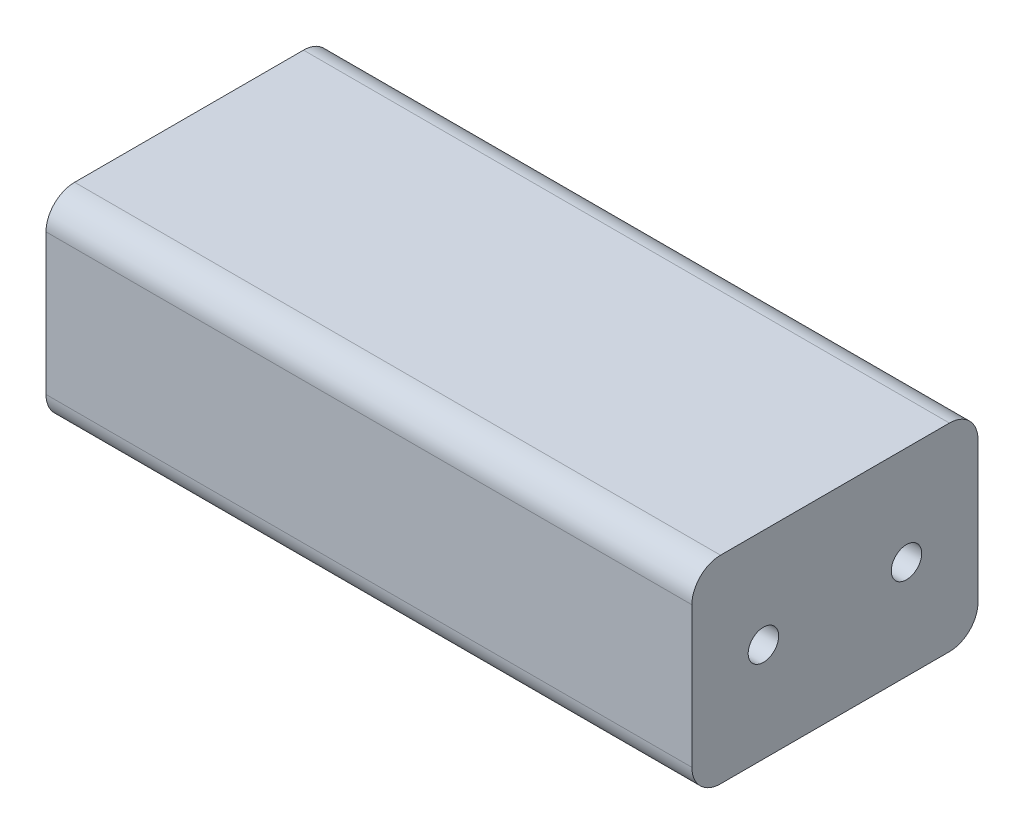
ISO-10303-21;
HEADER;
FILE_DESCRIPTION(('STEP AP214'),'2;1');
FILE_NAME('part.step','',(''),(''),'','','');
FILE_SCHEMA(('AUTOMOTIVE_DESIGN { 1 0 10303 214 1 1 1 1 }'));
ENDSEC;
DATA;
#1=APPLICATION_CONTEXT('core data for automotive mechanical design processes');
#2=APPLICATION_PROTOCOL_DEFINITION('international standard','automotive_design',2000,#1);
#3=PRODUCT_CONTEXT('',#1,'mechanical');
#4=PRODUCT('Part','Part','',(#3));
#5=PRODUCT_RELATED_PRODUCT_CATEGORY('part','',(#4));
#6=PRODUCT_DEFINITION_FORMATION('','',#4);
#7=PRODUCT_DEFINITION_CONTEXT('part definition',#1,'design');
#8=PRODUCT_DEFINITION('design','',#6,#7);
#9=PRODUCT_DEFINITION_SHAPE('','',#8);
#10=(LENGTH_UNIT() NAMED_UNIT(*) SI_UNIT(.MILLI.,.METRE.));
#11=(NAMED_UNIT(*) PLANE_ANGLE_UNIT() SI_UNIT($,.RADIAN.));
#12=(NAMED_UNIT(*) SI_UNIT($,.STERADIAN.) SOLID_ANGLE_UNIT());
#13=UNCERTAINTY_MEASURE_WITH_UNIT(LENGTH_MEASURE(1.E-05),#10,'distance_accuracy_value','');
#14=(GEOMETRIC_REPRESENTATION_CONTEXT(3) GLOBAL_UNCERTAINTY_ASSIGNED_CONTEXT((#13)) GLOBAL_UNIT_ASSIGNED_CONTEXT((#10,
#11,#12)) REPRESENTATION_CONTEXT('',''));
#15=CARTESIAN_POINT('',(0.,0.,0.));
#16=DIRECTION('',(0.,0.,1.));
#17=DIRECTION('',(1.,0.,0.));
#18=AXIS2_PLACEMENT_3D('',#15,#16,#17);
#19=CARTESIAN_POINT('',(28.67025,8.7910035,-12.7));
#20=DIRECTION('',(0.,0.,1.));
#21=DIRECTION('',(1.,0.,0.));
#22=AXIS2_PLACEMENT_3D('',#19,#20,#21);
#23=PLANE('',#22);
#24=DIRECTION('',(0.,1.,0.));
#25=VECTOR('',#24,1.);
#26=CARTESIAN_POINT('',(28.67025,8.7910035,-12.7));
#27=LINE('',#26,#25);
#28=CARTESIAN_POINT('',(28.67025,-6.2510035,-12.7));
#29=VERTEX_POINT('',#28);
#30=CARTESIAN_POINT('',(28.67025,6.2510035,-12.7));
#31=VERTEX_POINT('',#30);
#32=EDGE_CURVE('E154',#29,#31,#27,.T.);
#33=ORIENTED_EDGE('',*,*,#32,.F.);
#34=DIRECTION('',(-1.,0.,0.));
#35=VECTOR('',#34,1.);
#36=CARTESIAN_POINT('',(28.67025,-6.2510035,-12.7));
#37=LINE('',#36,#35);
#38=CARTESIAN_POINT('',(-28.67025,-6.2510035,-12.7));
#39=VERTEX_POINT('',#38);
#40=EDGE_CURVE('E176',#29,#39,#37,.T.);
#41=ORIENTED_EDGE('',*,*,#40,.T.);
#42=DIRECTION('',(0.,1.,0.));
#43=VECTOR('',#42,1.);
#44=CARTESIAN_POINT('',(-28.67025,8.7910035,-12.7));
#45=LINE('',#44,#43);
#46=CARTESIAN_POINT('',(-28.67025,6.2510035,-12.7));
#47=VERTEX_POINT('',#46);
#48=EDGE_CURVE('E153',#39,#47,#45,.T.);
#49=ORIENTED_EDGE('',*,*,#48,.T.);
#50=DIRECTION('',(-1.,0.,0.));
#51=VECTOR('',#50,1.);
#52=CARTESIAN_POINT('',(28.67025,6.2510035,-12.7));
#53=LINE('',#52,#51);
#54=EDGE_CURVE('E165',#47,#31,#53,.F.);
#55=ORIENTED_EDGE('',*,*,#54,.T.);
#56=EDGE_LOOP('',(#33,#41,#49,#55));
#57=FACE_BOUND('',#56,.T.);
#58=ADVANCED_FACE('F43',(#57),#23,.F.);
#59=CARTESIAN_POINT('',(28.67025,8.7910035,12.7));
#60=DIRECTION('',(0.,-1.,0.));
#61=DIRECTION('',(0.,0.,-1.));
#62=AXIS2_PLACEMENT_3D('',#59,#60,#61);
#63=PLANE('',#62);
#64=DIRECTION('',(0.,0.,1.));
#65=VECTOR('',#64,1.);
#66=CARTESIAN_POINT('',(28.67025,8.7910035,12.7));
#67=LINE('',#66,#65);
#68=CARTESIAN_POINT('',(28.67025,8.7910035,-10.16));
#69=VERTEX_POINT('',#68);
#70=CARTESIAN_POINT('',(28.67025,8.7910035,10.16));
#71=VERTEX_POINT('',#70);
#72=EDGE_CURVE('E157',#69,#71,#67,.T.);
#73=ORIENTED_EDGE('',*,*,#72,.F.);
#74=DIRECTION('',(-1.,0.,0.));
#75=VECTOR('',#74,1.);
#76=CARTESIAN_POINT('',(28.67025,8.7910035,-10.16));
#77=LINE('',#76,#75);
#78=CARTESIAN_POINT('',(-28.67025,8.7910035,-10.16));
#79=VERTEX_POINT('',#78);
#80=EDGE_CURVE('E11',#69,#79,#77,.T.);
#81=ORIENTED_EDGE('',*,*,#80,.T.);
#82=DIRECTION('',(0.,0.,1.));
#83=VECTOR('',#82,1.);
#84=CARTESIAN_POINT('',(-28.67025,8.7910035,12.7));
#85=LINE('',#84,#83);
#86=CARTESIAN_POINT('',(-28.67025,8.7910035,10.16));
#87=VERTEX_POINT('',#86);
#88=EDGE_CURVE('E168',#79,#87,#85,.T.);
#89=ORIENTED_EDGE('',*,*,#88,.T.);
#90=DIRECTION('',(-1.,0.,0.));
#91=VECTOR('',#90,1.);
#92=CARTESIAN_POINT('',(28.67025,8.7910035,10.16));
#93=LINE('',#92,#91);
#94=EDGE_CURVE('E51',#87,#71,#93,.F.);
#95=ORIENTED_EDGE('',*,*,#94,.T.);
#96=EDGE_LOOP('',(#73,#81,#89,#95));
#97=FACE_BOUND('',#96,.T.);
#98=ADVANCED_FACE('F205',(#97),#63,.F.);
#99=CARTESIAN_POINT('',(28.67025,8.7910035,12.7));
#100=DIRECTION('',(0.,0.,-1.));
#101=DIRECTION('',(0.,1.,0.));
#102=AXIS2_PLACEMENT_3D('',#99,#100,#101);
#103=PLANE('',#102);
#104=DIRECTION('',(0.,-1.,0.));
#105=VECTOR('',#104,1.);
#106=CARTESIAN_POINT('',(-28.67025,8.7910035,12.7));
#107=LINE('',#106,#105);
#108=CARTESIAN_POINT('',(-28.67025,6.2510035,12.7));
#109=VERTEX_POINT('',#108);
#110=CARTESIAN_POINT('',(-28.67025,-6.2510035,12.7));
#111=VERTEX_POINT('',#110);
#112=EDGE_CURVE('E171',#109,#111,#107,.T.);
#113=ORIENTED_EDGE('',*,*,#112,.T.);
#114=DIRECTION('',(-1.,0.,0.));
#115=VECTOR('',#114,1.);
#116=CARTESIAN_POINT('',(28.67025,-6.2510035,12.7));
#117=LINE('',#116,#115);
#118=CARTESIAN_POINT('',(28.67025,-6.2510035,12.7));
#119=VERTEX_POINT('',#118);
#120=EDGE_CURVE('E58',#111,#119,#117,.F.);
#121=ORIENTED_EDGE('',*,*,#120,.T.);
#122=DIRECTION('',(0.,-1.,0.));
#123=VECTOR('',#122,1.);
#124=CARTESIAN_POINT('',(28.67025,8.7910035,12.7));
#125=LINE('',#124,#123);
#126=CARTESIAN_POINT('',(28.67025,6.2510035,12.7));
#127=VERTEX_POINT('',#126);
#128=EDGE_CURVE('E160',#127,#119,#125,.T.);
#129=ORIENTED_EDGE('',*,*,#128,.F.);
#130=DIRECTION('',(-1.,0.,0.));
#131=VECTOR('',#130,1.);
#132=CARTESIAN_POINT('',(28.67025,6.2510035,12.7));
#133=LINE('',#132,#131);
#134=EDGE_CURVE('E199',#127,#109,#133,.T.);
#135=ORIENTED_EDGE('',*,*,#134,.T.);
#136=EDGE_LOOP('',(#113,#121,#129,#135));
#137=FACE_BOUND('',#136,.T.);
#138=ADVANCED_FACE('F213',(#137),#103,.F.);
#139=CARTESIAN_POINT('',(28.67025,-8.7910035,12.7));
#140=DIRECTION('',(0.,1.,0.));
#141=DIRECTION('',(0.,0.,1.));
#142=AXIS2_PLACEMENT_3D('',#139,#140,#141);
#143=PLANE('',#142);
#144=DIRECTION('',(0.,0.,-1.));
#145=VECTOR('',#144,1.);
#146=CARTESIAN_POINT('',(-28.67025,-8.7910035,12.7));
#147=LINE('',#146,#145);
#148=CARTESIAN_POINT('',(-28.67025,-8.7910035,10.16));
#149=VERTEX_POINT('',#148);
#150=CARTESIAN_POINT('',(-28.67025,-8.7910035,-10.16));
#151=VERTEX_POINT('',#150);
#152=EDGE_CURVE('E158',#149,#151,#147,.T.);
#153=ORIENTED_EDGE('',*,*,#152,.T.);
#154=DIRECTION('',(-1.,0.,0.));
#155=VECTOR('',#154,1.);
#156=CARTESIAN_POINT('',(28.67025,-8.7910035,-10.16));
#157=LINE('',#156,#155);
#158=CARTESIAN_POINT('',(28.67025,-8.7910035,-10.16));
#159=VERTEX_POINT('',#158);
#160=EDGE_CURVE('E190',#151,#159,#157,.F.);
#161=ORIENTED_EDGE('',*,*,#160,.T.);
#162=DIRECTION('',(0.,0.,-1.));
#163=VECTOR('',#162,1.);
#164=CARTESIAN_POINT('',(28.67025,-8.7910035,12.7));
#165=LINE('',#164,#163);
#166=CARTESIAN_POINT('',(28.67025,-8.7910035,10.16));
#167=VERTEX_POINT('',#166);
#168=EDGE_CURVE('E162',#167,#159,#165,.T.);
#169=ORIENTED_EDGE('',*,*,#168,.F.);
#170=DIRECTION('',(-1.,0.,0.));
#171=VECTOR('',#170,1.);
#172=CARTESIAN_POINT('',(28.67025,-8.7910035,10.16));
#173=LINE('',#172,#171);
#174=EDGE_CURVE('E187',#167,#149,#173,.T.);
#175=ORIENTED_EDGE('',*,*,#174,.T.);
#176=EDGE_LOOP('',(#153,#161,#169,#175));
#177=FACE_BOUND('',#176,.T.);
#178=ADVANCED_FACE('F224',(#177),#143,.F.);
#179=CARTESIAN_POINT('',(28.67025,0.,0.));
#180=DIRECTION('',(1.,0.,0.));
#181=DIRECTION('',(0.,0.,-1.));
#182=AXIS2_PLACEMENT_3D('',#179,#180,#181);
#183=PLANE('',#182);
#184=CARTESIAN_POINT('',(28.67025,0.,6.35));
#185=DIRECTION('',(1.,0.,0.));
#186=DIRECTION('',(0.,0.,-1.));
#187=AXIS2_PLACEMENT_3D('',#184,#185,#186);
#188=CIRCLE('',#187,1.35254999999999);
#189=CARTESIAN_POINT('',(28.67025,0.,4.99745000000001));
#190=VERTEX_POINT('',#189);
#191=EDGE_CURVE('E141',#190,#190,#188,.T.);
#192=ORIENTED_EDGE('',*,*,#191,.F.);
#193=EDGE_LOOP('',(#192));
#194=FACE_BOUND('',#193,.T.);
#195=CARTESIAN_POINT('',(28.67025,0.,-6.35));
#196=DIRECTION('',(1.,0.,0.));
#197=DIRECTION('',(0.,0.,-1.));
#198=AXIS2_PLACEMENT_3D('',#195,#196,#197);
#199=CIRCLE('',#198,1.35254999999999);
#200=CARTESIAN_POINT('',(28.67025,0.,-7.70254999999999));
#201=VERTEX_POINT('',#200);
#202=EDGE_CURVE('E147',#201,#201,#199,.T.);
#203=ORIENTED_EDGE('',*,*,#202,.F.);
#204=EDGE_LOOP('',(#203));
#205=FACE_BOUND('',#204,.T.);
#206=ORIENTED_EDGE('',*,*,#168,.T.);
#207=CARTESIAN_POINT('',(28.67025,-6.2510035,-10.16));
#208=DIRECTION('',(1.,0.,0.));
#209=DIRECTION('',(0.,0.,-1.));
#210=AXIS2_PLACEMENT_3D('',#207,#208,#209);
#211=CIRCLE('',#210,2.54);
#212=EDGE_CURVE('E197',#159,#29,#211,.T.);
#213=ORIENTED_EDGE('',*,*,#212,.T.);
#214=ORIENTED_EDGE('',*,*,#32,.T.);
#215=CARTESIAN_POINT('',(28.67025,6.2510035,-10.16));
#216=DIRECTION('',(1.,0.,0.));
#217=DIRECTION('',(0.,0.,-1.));
#218=AXIS2_PLACEMENT_3D('',#215,#216,#217);
#219=CIRCLE('',#218,2.54);
#220=EDGE_CURVE('E193',#31,#69,#219,.T.);
#221=ORIENTED_EDGE('',*,*,#220,.T.);
#222=ORIENTED_EDGE('',*,*,#72,.T.);
#223=CARTESIAN_POINT('',(28.67025,6.2510035,10.16));
#224=DIRECTION('',(1.,0.,0.));
#225=DIRECTION('',(0.,0.,-1.));
#226=AXIS2_PLACEMENT_3D('',#223,#224,#225);
#227=CIRCLE('',#226,2.54);
#228=EDGE_CURVE('E65',#71,#127,#227,.T.);
#229=ORIENTED_EDGE('',*,*,#228,.T.);
#230=ORIENTED_EDGE('',*,*,#128,.T.);
#231=CARTESIAN_POINT('',(28.67025,-6.2510035,10.16));
#232=DIRECTION('',(1.,0.,0.));
#233=DIRECTION('',(0.,0.,-1.));
#234=AXIS2_PLACEMENT_3D('',#231,#232,#233);
#235=CIRCLE('',#234,2.54);
#236=EDGE_CURVE('E195',#119,#167,#235,.T.);
#237=ORIENTED_EDGE('',*,*,#236,.T.);
#238=EDGE_LOOP('',(#206,#213,#214,#221,#222,#229,#230,#237));
#239=FACE_BOUND('',#238,.T.);
#240=ADVANCED_FACE('F209',(#194,#205,#239),#183,.T.);
#241=CARTESIAN_POINT('',(-28.67025,0.,0.));
#242=DIRECTION('',(1.,0.,0.));
#243=DIRECTION('',(0.,0.,-1.));
#244=AXIS2_PLACEMENT_3D('',#241,#242,#243);
#245=PLANE('',#244);
#246=CARTESIAN_POINT('',(-28.67025,0.,6.35));
#247=DIRECTION('',(-1.,0.,0.));
#248=DIRECTION('',(0.,0.,1.));
#249=AXIS2_PLACEMENT_3D('',#246,#247,#248);
#250=CIRCLE('',#249,1.35254999999999);
#251=CARTESIAN_POINT('',(-28.67025,0.,7.70254999999999));
#252=VERTEX_POINT('',#251);
#253=EDGE_CURVE('E131',#252,#252,#250,.T.);
#254=ORIENTED_EDGE('',*,*,#253,.F.);
#255=EDGE_LOOP('',(#254));
#256=FACE_BOUND('',#255,.T.);
#257=CARTESIAN_POINT('',(-28.67025,0.,-6.35));
#258=DIRECTION('',(-1.,0.,0.));
#259=DIRECTION('',(0.,0.,1.));
#260=AXIS2_PLACEMENT_3D('',#257,#258,#259);
#261=CIRCLE('',#260,1.35254999999999);
#262=CARTESIAN_POINT('',(-28.67025,0.,-4.99745000000001));
#263=VERTEX_POINT('',#262);
#264=EDGE_CURVE('E130',#263,#263,#261,.T.);
#265=ORIENTED_EDGE('',*,*,#264,.F.);
#266=EDGE_LOOP('',(#265));
#267=FACE_BOUND('',#266,.T.);
#268=ORIENTED_EDGE('',*,*,#48,.F.);
#269=CARTESIAN_POINT('',(-28.67025,-6.2510035,-10.16));
#270=DIRECTION('',(1.,0.,0.));
#271=DIRECTION('',(0.,0.,-1.));
#272=AXIS2_PLACEMENT_3D('',#269,#270,#271);
#273=CIRCLE('',#272,2.54);
#274=EDGE_CURVE('E185',#39,#151,#273,.F.);
#275=ORIENTED_EDGE('',*,*,#274,.T.);
#276=ORIENTED_EDGE('',*,*,#152,.F.);
#277=CARTESIAN_POINT('',(-28.67025,-6.2510035,10.16));
#278=DIRECTION('',(1.,0.,0.));
#279=DIRECTION('',(0.,0.,-1.));
#280=AXIS2_PLACEMENT_3D('',#277,#278,#279);
#281=CIRCLE('',#280,2.54);
#282=EDGE_CURVE('E183',#149,#111,#281,.F.);
#283=ORIENTED_EDGE('',*,*,#282,.T.);
#284=ORIENTED_EDGE('',*,*,#112,.F.);
#285=CARTESIAN_POINT('',(-28.67025,6.2510035,10.16));
#286=DIRECTION('',(1.,0.,0.));
#287=DIRECTION('',(0.,0.,-1.));
#288=AXIS2_PLACEMENT_3D('',#285,#286,#287);
#289=CIRCLE('',#288,2.54);
#290=EDGE_CURVE('E179',#109,#87,#289,.F.);
#291=ORIENTED_EDGE('',*,*,#290,.T.);
#292=ORIENTED_EDGE('',*,*,#88,.F.);
#293=CARTESIAN_POINT('',(-28.67025,6.2510035,-10.16));
#294=DIRECTION('',(1.,0.,0.));
#295=DIRECTION('',(0.,0.,-1.));
#296=AXIS2_PLACEMENT_3D('',#293,#294,#295);
#297=CIRCLE('',#296,2.54);
#298=EDGE_CURVE('E181',#79,#47,#297,.F.);
#299=ORIENTED_EDGE('',*,*,#298,.T.);
#300=EDGE_LOOP('',(#268,#275,#276,#283,#284,#291,#292,#299));
#301=FACE_BOUND('',#300,.T.);
#302=ADVANCED_FACE('F216',(#256,#267,#301),#245,.F.);
#303=CARTESIAN_POINT('',(19.27225,0.,-6.35));
#304=DIRECTION('',(1.,0.,0.));
#305=DIRECTION('',(0.,0.,-1.));
#306=AXIS2_PLACEMENT_3D('',#303,#304,#305);
#307=CONICAL_SURFACE('',#306,1.35254999999999,1.02974425867665);
#308=CARTESIAN_POINT('',(18.4595559697343,0.,-6.35));
#309=VERTEX_POINT('',#308);
#310=VERTEX_LOOP('',#309);
#311=FACE_BOUND('',#310,.T.);
#312=CARTESIAN_POINT('',(19.27225,0.,-6.35));
#313=DIRECTION('',(1.,0.,0.));
#314=DIRECTION('',(0.,0.,-1.));
#315=AXIS2_PLACEMENT_3D('',#312,#313,#314);
#316=CIRCLE('',#315,1.35254999999999);
#317=CARTESIAN_POINT('',(19.27225,0.,-7.70254999999999));
#318=VERTEX_POINT('',#317);
#319=EDGE_CURVE('E150',#318,#318,#316,.T.);
#320=ORIENTED_EDGE('',*,*,#319,.T.);
#321=EDGE_LOOP('',(#320));
#322=FACE_BOUND('',#321,.T.);
#323=ADVANCED_FACE('F276',(#311,#322),#307,.F.);
#324=CARTESIAN_POINT('',(28.67025,0.,-6.35));
#325=DIRECTION('',(1.,0.,0.));
#326=DIRECTION('',(0.,0.,-1.));
#327=AXIS2_PLACEMENT_3D('',#324,#325,#326);
#328=CYLINDRICAL_SURFACE('',#327,1.35254999999999);
#329=ORIENTED_EDGE('',*,*,#319,.F.);
#330=EDGE_LOOP('',(#329));
#331=FACE_BOUND('',#330,.T.);
#332=ORIENTED_EDGE('',*,*,#202,.T.);
#333=EDGE_LOOP('',(#332));
#334=FACE_BOUND('',#333,.T.);
#335=ADVANCED_FACE('F272',(#331,#334),#328,.F.);
#336=CARTESIAN_POINT('',(19.27225,0.,6.35));
#337=DIRECTION('',(1.,0.,0.));
#338=DIRECTION('',(0.,0.,-1.));
#339=AXIS2_PLACEMENT_3D('',#336,#337,#338);
#340=CONICAL_SURFACE('',#339,1.35254999999999,1.02974425867665);
#341=CARTESIAN_POINT('',(18.4595559697343,0.,6.35));
#342=VERTEX_POINT('',#341);
#343=VERTEX_LOOP('',#342);
#344=FACE_BOUND('',#343,.T.);
#345=CARTESIAN_POINT('',(19.27225,0.,6.35));
#346=DIRECTION('',(1.,0.,0.));
#347=DIRECTION('',(0.,0.,-1.));
#348=AXIS2_PLACEMENT_3D('',#345,#346,#347);
#349=CIRCLE('',#348,1.35254999999999);
#350=CARTESIAN_POINT('',(19.27225,0.,4.99745000000001));
#351=VERTEX_POINT('',#350);
#352=EDGE_CURVE('E144',#351,#351,#349,.T.);
#353=ORIENTED_EDGE('',*,*,#352,.T.);
#354=EDGE_LOOP('',(#353));
#355=FACE_BOUND('',#354,.T.);
#356=ADVANCED_FACE('F268',(#344,#355),#340,.F.);
#357=CARTESIAN_POINT('',(28.67025,0.,6.35));
#358=DIRECTION('',(1.,0.,0.));
#359=DIRECTION('',(0.,0.,-1.));
#360=AXIS2_PLACEMENT_3D('',#357,#358,#359);
#361=CYLINDRICAL_SURFACE('',#360,1.35254999999999);
#362=ORIENTED_EDGE('',*,*,#352,.F.);
#363=EDGE_LOOP('',(#362));
#364=FACE_BOUND('',#363,.T.);
#365=ORIENTED_EDGE('',*,*,#191,.T.);
#366=EDGE_LOOP('',(#365));
#367=FACE_BOUND('',#366,.T.);
#368=ADVANCED_FACE('F264',(#364,#367),#361,.F.);
#369=CARTESIAN_POINT('',(-19.27225,0.,-6.35));
#370=DIRECTION('',(-1.,0.,0.));
#371=DIRECTION('',(0.,0.,1.));
#372=AXIS2_PLACEMENT_3D('',#369,#370,#371);
#373=CONICAL_SURFACE('',#372,1.35254999999999,1.02974425867665);
#374=CARTESIAN_POINT('',(-18.4595559697343,0.,-6.35));
#375=VERTEX_POINT('',#374);
#376=VERTEX_LOOP('',#375);
#377=FACE_BOUND('',#376,.T.);
#378=CARTESIAN_POINT('',(-19.27225,0.,-6.35));
#379=DIRECTION('',(-1.,0.,0.));
#380=DIRECTION('',(0.,0.,1.));
#381=AXIS2_PLACEMENT_3D('',#378,#379,#380);
#382=CIRCLE('',#381,1.35254999999999);
#383=CARTESIAN_POINT('',(-19.27225,0.,-4.99745000000002));
#384=VERTEX_POINT('',#383);
#385=EDGE_CURVE('E134',#384,#384,#382,.T.);
#386=ORIENTED_EDGE('',*,*,#385,.T.);
#387=EDGE_LOOP('',(#386));
#388=FACE_BOUND('',#387,.T.);
#389=ADVANCED_FACE('F260',(#377,#388),#373,.F.);
#390=CARTESIAN_POINT('',(-28.67025,0.,-6.35));
#391=DIRECTION('',(-1.,0.,0.));
#392=DIRECTION('',(0.,0.,1.));
#393=AXIS2_PLACEMENT_3D('',#390,#391,#392);
#394=CYLINDRICAL_SURFACE('',#393,1.35254999999999);
#395=ORIENTED_EDGE('',*,*,#385,.F.);
#396=EDGE_LOOP('',(#395));
#397=FACE_BOUND('',#396,.T.);
#398=ORIENTED_EDGE('',*,*,#264,.T.);
#399=EDGE_LOOP('',(#398));
#400=FACE_BOUND('',#399,.T.);
#401=ADVANCED_FACE('F124',(#397,#400),#394,.F.);
#402=CARTESIAN_POINT('',(-19.27225,0.,6.35));
#403=DIRECTION('',(-1.,0.,0.));
#404=DIRECTION('',(0.,0.,1.));
#405=AXIS2_PLACEMENT_3D('',#402,#403,#404);
#406=CONICAL_SURFACE('',#405,1.35254999999999,1.02974425867665);
#407=CARTESIAN_POINT('',(-18.4595559697343,0.,6.35));
#408=VERTEX_POINT('',#407);
#409=VERTEX_LOOP('',#408);
#410=FACE_BOUND('',#409,.T.);
#411=CARTESIAN_POINT('',(-19.27225,0.,6.35));
#412=DIRECTION('',(-1.,0.,0.));
#413=DIRECTION('',(0.,0.,1.));
#414=AXIS2_PLACEMENT_3D('',#411,#412,#413);
#415=CIRCLE('',#414,1.35254999999999);
#416=CARTESIAN_POINT('',(-19.27225,0.,7.70254999999999));
#417=VERTEX_POINT('',#416);
#418=EDGE_CURVE('E128',#417,#417,#415,.T.);
#419=ORIENTED_EDGE('',*,*,#418,.T.);
#420=EDGE_LOOP('',(#419));
#421=FACE_BOUND('',#420,.T.);
#422=ADVANCED_FACE('F120',(#410,#421),#406,.F.);
#423=CARTESIAN_POINT('',(-28.67025,0.,6.35));
#424=DIRECTION('',(-1.,0.,0.));
#425=DIRECTION('',(0.,0.,1.));
#426=AXIS2_PLACEMENT_3D('',#423,#424,#425);
#427=CYLINDRICAL_SURFACE('',#426,1.35254999999999);
#428=ORIENTED_EDGE('',*,*,#418,.F.);
#429=EDGE_LOOP('',(#428));
#430=FACE_BOUND('',#429,.T.);
#431=ORIENTED_EDGE('',*,*,#253,.T.);
#432=EDGE_LOOP('',(#431));
#433=FACE_BOUND('',#432,.T.);
#434=ADVANCED_FACE('F123',(#430,#433),#427,.F.);
#435=CARTESIAN_POINT('',(28.67025,-6.2510035,-10.16));
#436=DIRECTION('',(-1.,0.,0.));
#437=DIRECTION('',(0.,0.,1.));
#438=AXIS2_PLACEMENT_3D('',#435,#436,#437);
#439=CYLINDRICAL_SURFACE('',#438,2.54);
#440=ORIENTED_EDGE('',*,*,#212,.F.);
#441=ORIENTED_EDGE('',*,*,#160,.F.);
#442=ORIENTED_EDGE('',*,*,#274,.F.);
#443=ORIENTED_EDGE('',*,*,#40,.F.);
#444=EDGE_LOOP('',(#440,#441,#442,#443));
#445=FACE_BOUND('',#444,.T.);
#446=ADVANCED_FACE('F230',(#445),#439,.T.);
#447=CARTESIAN_POINT('',(28.67025,-6.2510035,10.16));
#448=DIRECTION('',(-1.,0.,0.));
#449=DIRECTION('',(0.,0.,1.));
#450=AXIS2_PLACEMENT_3D('',#447,#448,#449);
#451=CYLINDRICAL_SURFACE('',#450,2.54);
#452=ORIENTED_EDGE('',*,*,#236,.F.);
#453=ORIENTED_EDGE('',*,*,#120,.F.);
#454=ORIENTED_EDGE('',*,*,#282,.F.);
#455=ORIENTED_EDGE('',*,*,#174,.F.);
#456=EDGE_LOOP('',(#452,#453,#454,#455));
#457=FACE_BOUND('',#456,.T.);
#458=ADVANCED_FACE('F221',(#457),#451,.T.);
#459=CARTESIAN_POINT('',(28.67025,6.2510035,-10.16));
#460=DIRECTION('',(-1.,0.,0.));
#461=DIRECTION('',(0.,0.,1.));
#462=AXIS2_PLACEMENT_3D('',#459,#460,#461);
#463=CYLINDRICAL_SURFACE('',#462,2.54);
#464=ORIENTED_EDGE('',*,*,#220,.F.);
#465=ORIENTED_EDGE('',*,*,#54,.F.);
#466=ORIENTED_EDGE('',*,*,#298,.F.);
#467=ORIENTED_EDGE('',*,*,#80,.F.);
#468=EDGE_LOOP('',(#464,#465,#466,#467));
#469=FACE_BOUND('',#468,.T.);
#470=ADVANCED_FACE('F234',(#469),#463,.T.);
#471=CARTESIAN_POINT('',(28.67025,6.2510035,10.16));
#472=DIRECTION('',(-1.,0.,0.));
#473=DIRECTION('',(0.,0.,1.));
#474=AXIS2_PLACEMENT_3D('',#471,#472,#473);
#475=CYLINDRICAL_SURFACE('',#474,2.54);
#476=ORIENTED_EDGE('',*,*,#228,.F.);
#477=ORIENTED_EDGE('',*,*,#94,.F.);
#478=ORIENTED_EDGE('',*,*,#290,.F.);
#479=ORIENTED_EDGE('',*,*,#134,.F.);
#480=EDGE_LOOP('',(#476,#477,#478,#479));
#481=FACE_BOUND('',#480,.T.);
#482=ADVANCED_FACE('F45',(#481),#475,.T.);
#483=CLOSED_SHELL('',(#58,#98,#138,#178,#240,#302,#323,#335,#356,#368,#389,#401,#422,#434,#446,
#458,#470,#482));
#484=MANIFOLD_SOLID_BREP('B2',#483);
#485=ADVANCED_BREP_SHAPE_REPRESENTATION('',(#18,#484),#14);
#486=SHAPE_DEFINITION_REPRESENTATION(#9,#485);
ENDSEC;
END-ISO-10303-21;
